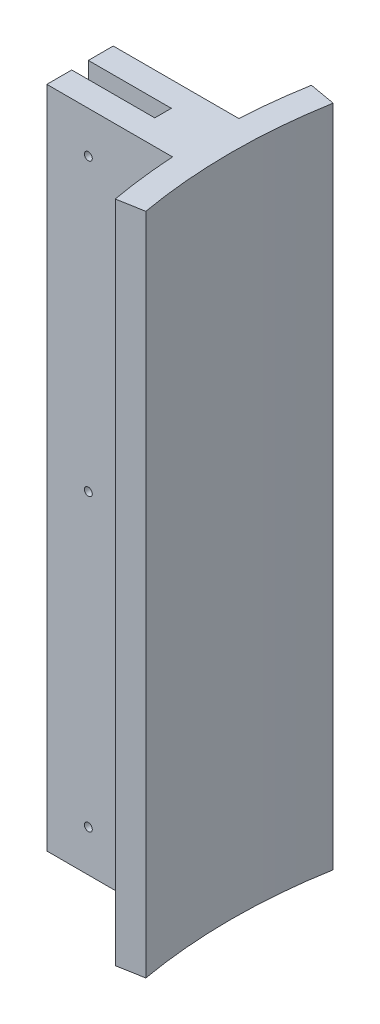
ISO-10303-21;
HEADER;
FILE_DESCRIPTION(('STEP AP214'),'2;1');
FILE_NAME('part.step','',(''),(''),'','','');
FILE_SCHEMA(('AUTOMOTIVE_DESIGN { 1 0 10303 214 1 1 1 1 }'));
ENDSEC;
DATA;
#1=APPLICATION_CONTEXT('core data for automotive mechanical design processes');
#2=APPLICATION_PROTOCOL_DEFINITION('international standard','automotive_design',2000,#1);
#3=PRODUCT_CONTEXT('',#1,'mechanical');
#4=PRODUCT('Part','Part','',(#3));
#5=PRODUCT_RELATED_PRODUCT_CATEGORY('part','',(#4));
#6=PRODUCT_DEFINITION_FORMATION('','',#4);
#7=PRODUCT_DEFINITION_CONTEXT('part definition',#1,'design');
#8=PRODUCT_DEFINITION('design','',#6,#7);
#9=PRODUCT_DEFINITION_SHAPE('','',#8);
#10=(LENGTH_UNIT() NAMED_UNIT(*) SI_UNIT(.MILLI.,.METRE.));
#11=(NAMED_UNIT(*) PLANE_ANGLE_UNIT() SI_UNIT($,.RADIAN.));
#12=(NAMED_UNIT(*) SI_UNIT($,.STERADIAN.) SOLID_ANGLE_UNIT());
#13=UNCERTAINTY_MEASURE_WITH_UNIT(LENGTH_MEASURE(1.E-05),#10,'distance_accuracy_value','');
#14=(GEOMETRIC_REPRESENTATION_CONTEXT(3) GLOBAL_UNCERTAINTY_ASSIGNED_CONTEXT((#13)) GLOBAL_UNIT_ASSIGNED_CONTEXT((#10,
#11,#12)) REPRESENTATION_CONTEXT('',''));
#15=CARTESIAN_POINT('',(0.,0.,0.));
#16=DIRECTION('',(0.,0.,1.));
#17=DIRECTION('',(1.,0.,0.));
#18=AXIS2_PLACEMENT_3D('',#15,#16,#17);
#19=CARTESIAN_POINT('',(0.,80.,0.));
#20=DIRECTION('',(0.,-1.,0.));
#21=DIRECTION('',(0.,0.,-1.));
#22=AXIS2_PLACEMENT_3D('',#19,#20,#21);
#23=CYLINDRICAL_SURFACE('',#22,65.);
#24=CARTESIAN_POINT('',(0.,0.,0.));
#25=DIRECTION('',(0.,-1.,0.));
#26=DIRECTION('',(0.,0.,-1.));
#27=AXIS2_PLACEMENT_3D('',#24,#25,#26);
#28=CIRCLE('',#27,65.);
#29=CARTESIAN_POINT('',(-64.0125039457936,0.,11.2871315483504));
#30=VERTEX_POINT('',#29);
#31=CARTESIAN_POINT('',(-64.0125039457936,0.,-11.2871315483505));
#32=VERTEX_POINT('',#31);
#33=EDGE_CURVE('E167',#30,#32,#28,.T.);
#34=ORIENTED_EDGE('',*,*,#33,.T.);
#35=DIRECTION('',(0.,-1.,0.));
#36=VECTOR('',#35,1.);
#37=CARTESIAN_POINT('',(-64.0125039457936,80.,-11.2871315483505));
#38=LINE('',#37,#36);
#39=CARTESIAN_POINT('',(-64.0125039457936,80.,-11.2871315483505));
#40=VERTEX_POINT('',#39);
#41=EDGE_CURVE('E11',#40,#32,#38,.T.);
#42=ORIENTED_EDGE('',*,*,#41,.F.);
#43=CARTESIAN_POINT('',(0.,80.,0.));
#44=DIRECTION('',(0.,-1.,0.));
#45=DIRECTION('',(0.,0.,-1.));
#46=AXIS2_PLACEMENT_3D('',#43,#44,#45);
#47=CIRCLE('',#46,65.);
#48=CARTESIAN_POINT('',(-64.0125039457936,80.,11.2871315483504));
#49=VERTEX_POINT('',#48);
#50=EDGE_CURVE('E204',#49,#40,#47,.T.);
#51=ORIENTED_EDGE('',*,*,#50,.F.);
#52=DIRECTION('',(0.,-1.,0.));
#53=VECTOR('',#52,1.);
#54=CARTESIAN_POINT('',(-64.0125039457936,80.,11.2871315483504));
#55=LINE('',#54,#53);
#56=EDGE_CURVE('E163',#49,#30,#55,.T.);
#57=ORIENTED_EDGE('',*,*,#56,.T.);
#58=EDGE_LOOP('',(#34,#42,#51,#57));
#59=FACE_BOUND('',#58,.T.);
#60=ADVANCED_FACE('F43',(#59),#23,.F.);
#61=CARTESIAN_POINT('',(-64.0125039457936,80.,-11.2871315483505));
#62=DIRECTION('',(-0.173648177666932,0.,0.984807753012208));
#63=DIRECTION('',(0.984807753012208,0.,0.173648177666932));
#64=AXIS2_PLACEMENT_3D('',#61,#62,#63);
#65=PLANE('',#64);
#66=DIRECTION('',(-0.984807753012208,0.,-0.173648177666932));
#67=VECTOR('',#66,1.);
#68=CARTESIAN_POINT('',(-64.0125039457936,0.,-11.2871315483505));
#69=LINE('',#68,#67);
#70=CARTESIAN_POINT('',(-67.1877704342609,0.,-11.8470167012067));
#71=VERTEX_POINT('',#70);
#72=EDGE_CURVE('E171',#32,#71,#69,.T.);
#73=ORIENTED_EDGE('',*,*,#72,.T.);
#74=DIRECTION('',(0.,-1.,0.));
#75=VECTOR('',#74,1.);
#76=CARTESIAN_POINT('',(-67.1877704342609,80.,-11.8470167012067));
#77=LINE('',#76,#75);
#78=CARTESIAN_POINT('',(-67.1877704342609,80.,-11.8470167012067));
#79=VERTEX_POINT('',#78);
#80=EDGE_CURVE('E52',#79,#71,#77,.T.);
#81=ORIENTED_EDGE('',*,*,#80,.F.);
#82=DIRECTION('',(-0.984807753012208,0.,-0.173648177666932));
#83=VECTOR('',#82,1.);
#84=CARTESIAN_POINT('',(-64.0125039457936,80.,-11.2871315483505));
#85=LINE('',#84,#83);
#86=EDGE_CURVE('E115',#40,#79,#85,.T.);
#87=ORIENTED_EDGE('',*,*,#86,.F.);
#88=ORIENTED_EDGE('',*,*,#41,.T.);
#89=EDGE_LOOP('',(#73,#81,#87,#88));
#90=FACE_BOUND('',#89,.T.);
#91=ADVANCED_FACE('F298',(#90),#65,.F.);
#92=CARTESIAN_POINT('',(-0.203476318140439,80.,-0.137860379546595));
#93=DIRECTION('',(0.,-1.,0.));
#94=DIRECTION('',(0.,0.,-1.));
#95=AXIS2_PLACEMENT_3D('',#92,#93,#94);
#96=CYLINDRICAL_SURFACE('',#95,68.);
#97=CARTESIAN_POINT('',(-0.203476318140439,0.,-0.137860379546595));
#98=DIRECTION('',(0.,1.,0.));
#99=DIRECTION('',(0.,0.,-1.));
#100=AXIS2_PLACEMENT_3D('',#97,#98,#99);
#101=CIRCLE('',#100,68.);
#102=CARTESIAN_POINT('',(-68.0937103547979,0.,-3.99999999999999));
#103=VERTEX_POINT('',#102);
#104=EDGE_CURVE('E175',#71,#103,#101,.T.);
#105=ORIENTED_EDGE('',*,*,#104,.T.);
#106=DIRECTION('',(0.,-1.,0.));
#107=VECTOR('',#106,1.);
#108=CARTESIAN_POINT('',(-68.0937103547979,80.,-3.99999999999999));
#109=LINE('',#108,#107);
#110=CARTESIAN_POINT('',(-68.0937103547979,80.,-3.99999999999999));
#111=VERTEX_POINT('',#110);
#112=EDGE_CURVE('E231',#111,#103,#109,.T.);
#113=ORIENTED_EDGE('',*,*,#112,.F.);
#114=CARTESIAN_POINT('',(-0.203476318140439,80.,-0.137860379546595));
#115=DIRECTION('',(0.,1.,0.));
#116=DIRECTION('',(0.,0.,-1.));
#117=AXIS2_PLACEMENT_3D('',#114,#115,#116);
#118=CIRCLE('',#117,68.);
#119=EDGE_CURVE('E241',#79,#111,#118,.T.);
#120=ORIENTED_EDGE('',*,*,#119,.F.);
#121=ORIENTED_EDGE('',*,*,#80,.T.);
#122=EDGE_LOOP('',(#105,#113,#120,#121));
#123=FACE_BOUND('',#122,.T.);
#124=ADVANCED_FACE('F239',(#123),#96,.T.);
#125=CARTESIAN_POINT('',(-68.2227730134308,80.,-3.99999999999999));
#126=DIRECTION('',(0.,0.,1.));
#127=DIRECTION('',(1.,0.,0.));
#128=AXIS2_PLACEMENT_3D('',#125,#126,#127);
#129=PLANE('',#128);
#130=CARTESIAN_POINT('',(-78.2227730134308,75.,-3.99999999999999));
#131=DIRECTION('',(0.,0.,1.));
#132=DIRECTION('',(1.,0.,0.));
#133=AXIS2_PLACEMENT_3D('',#130,#131,#132);
#134=CIRCLE('',#133,0.474999999999989);
#135=CARTESIAN_POINT('',(-77.7477730134308,75.,-3.99999999999999));
#136=VERTEX_POINT('',#135);
#137=EDGE_CURVE('E546',#136,#136,#134,.T.);
#138=ORIENTED_EDGE('',*,*,#137,.T.);
#139=EDGE_LOOP('',(#138));
#140=FACE_BOUND('',#139,.T.);
#141=CARTESIAN_POINT('',(-78.2227730134308,40.,-3.99999999999999));
#142=DIRECTION('',(0.,0.,1.));
#143=DIRECTION('',(1.,0.,0.));
#144=AXIS2_PLACEMENT_3D('',#141,#142,#143);
#145=CIRCLE('',#144,0.474999999999989);
#146=CARTESIAN_POINT('',(-77.7477730134308,40.,-3.99999999999999));
#147=VERTEX_POINT('',#146);
#148=EDGE_CURVE('E343',#147,#147,#145,.T.);
#149=ORIENTED_EDGE('',*,*,#148,.T.);
#150=EDGE_LOOP('',(#149));
#151=FACE_BOUND('',#150,.T.);
#152=CARTESIAN_POINT('',(-78.2227730134308,5.,-3.99999999999999));
#153=DIRECTION('',(0.,0.,1.));
#154=DIRECTION('',(1.,0.,0.));
#155=AXIS2_PLACEMENT_3D('',#152,#153,#154);
#156=CIRCLE('',#155,0.474999999999989);
#157=CARTESIAN_POINT('',(-77.7477730134308,5.,-3.99999999999999));
#158=VERTEX_POINT('',#157);
#159=EDGE_CURVE('E172',#158,#158,#156,.T.);
#160=ORIENTED_EDGE('',*,*,#159,.T.);
#161=EDGE_LOOP('',(#160));
#162=FACE_BOUND('',#161,.T.);
#163=DIRECTION('',(-1.,0.,0.));
#164=VECTOR('',#163,1.);
#165=CARTESIAN_POINT('',(-68.2227730134308,0.,-3.99999999999999));
#166=LINE('',#165,#164);
#167=CARTESIAN_POINT('',(-83.2227730134308,0.,-3.99999999999999));
#168=VERTEX_POINT('',#167);
#169=EDGE_CURVE('E179',#103,#168,#166,.T.);
#170=ORIENTED_EDGE('',*,*,#169,.T.);
#171=DIRECTION('',(0.,-1.,0.));
#172=VECTOR('',#171,1.);
#173=CARTESIAN_POINT('',(-83.2227730134308,80.,-3.99999999999999));
#174=LINE('',#173,#172);
#175=CARTESIAN_POINT('',(-83.2227730134308,80.,-3.99999999999999));
#176=VERTEX_POINT('',#175);
#177=EDGE_CURVE('E227',#176,#168,#174,.T.);
#178=ORIENTED_EDGE('',*,*,#177,.F.);
#179=DIRECTION('',(-1.,0.,0.));
#180=VECTOR('',#179,1.);
#181=CARTESIAN_POINT('',(-68.2227730134308,80.,-3.99999999999999));
#182=LINE('',#181,#180);
#183=EDGE_CURVE('E259',#111,#176,#182,.T.);
#184=ORIENTED_EDGE('',*,*,#183,.F.);
#185=ORIENTED_EDGE('',*,*,#112,.T.);
#186=EDGE_LOOP('',(#170,#178,#184,#185));
#187=FACE_BOUND('',#186,.T.);
#188=ADVANCED_FACE('F249',(#140,#151,#162,#187),#129,.F.);
#189=CARTESIAN_POINT('',(-83.2227730134308,80.,-3.99999999999999));
#190=DIRECTION('',(1.,0.,0.));
#191=DIRECTION('',(0.,0.,-1.));
#192=AXIS2_PLACEMENT_3D('',#189,#190,#191);
#193=PLANE('',#192);
#194=DIRECTION('',(0.,0.,1.));
#195=VECTOR('',#194,1.);
#196=CARTESIAN_POINT('',(-83.2227730134308,0.,-3.99999999999999));
#197=LINE('',#196,#195);
#198=CARTESIAN_POINT('',(-83.2227730134308,0.,-1.00000000000002));
#199=VERTEX_POINT('',#198);
#200=EDGE_CURVE('E182',#168,#199,#197,.T.);
#201=ORIENTED_EDGE('',*,*,#200,.T.);
#202=DIRECTION('',(0.,-1.,0.));
#203=VECTOR('',#202,1.);
#204=CARTESIAN_POINT('',(-83.2227730134308,80.,-1.00000000000002));
#205=LINE('',#204,#203);
#206=CARTESIAN_POINT('',(-83.2227730134308,80.,-1.00000000000002));
#207=VERTEX_POINT('',#206);
#208=EDGE_CURVE('E223',#207,#199,#205,.T.);
#209=ORIENTED_EDGE('',*,*,#208,.F.);
#210=DIRECTION('',(0.,0.,1.));
#211=VECTOR('',#210,1.);
#212=CARTESIAN_POINT('',(-83.2227730134308,80.,-3.99999999999999));
#213=LINE('',#212,#211);
#214=EDGE_CURVE('E255',#176,#207,#213,.T.);
#215=ORIENTED_EDGE('',*,*,#214,.F.);
#216=ORIENTED_EDGE('',*,*,#177,.T.);
#217=EDGE_LOOP('',(#201,#209,#215,#216));
#218=FACE_BOUND('',#217,.T.);
#219=ADVANCED_FACE('F253',(#218),#193,.F.);
#220=CARTESIAN_POINT('',(-83.2227730134308,80.,-1.00000000000002));
#221=DIRECTION('',(0.,0.,-1.));
#222=DIRECTION('',(-1.,0.,0.));
#223=AXIS2_PLACEMENT_3D('',#220,#221,#222);
#224=PLANE('',#223);
#225=CARTESIAN_POINT('',(-78.2227730134308,75.,-1.00000000000002));
#226=DIRECTION('',(0.,0.,-1.));
#227=DIRECTION('',(-1.,0.,0.));
#228=AXIS2_PLACEMENT_3D('',#225,#226,#227);
#229=CIRCLE('',#228,0.474999999999989);
#230=CARTESIAN_POINT('',(-78.6977730134308,75.,-1.00000000000002));
#231=VERTEX_POINT('',#230);
#232=EDGE_CURVE('E550',#231,#231,#229,.T.);
#233=ORIENTED_EDGE('',*,*,#232,.T.);
#234=EDGE_LOOP('',(#233));
#235=FACE_BOUND('',#234,.T.);
#236=CARTESIAN_POINT('',(-78.2227730134308,40.,-1.00000000000002));
#237=DIRECTION('',(0.,0.,-1.));
#238=DIRECTION('',(-1.,0.,0.));
#239=AXIS2_PLACEMENT_3D('',#236,#237,#238);
#240=CIRCLE('',#239,0.474999999999989);
#241=CARTESIAN_POINT('',(-78.6977730134308,40.,-1.00000000000002));
#242=VERTEX_POINT('',#241);
#243=EDGE_CURVE('E351',#242,#242,#240,.T.);
#244=ORIENTED_EDGE('',*,*,#243,.T.);
#245=EDGE_LOOP('',(#244));
#246=FACE_BOUND('',#245,.T.);
#247=CARTESIAN_POINT('',(-78.2227730134308,5.,-1.00000000000002));
#248=DIRECTION('',(0.,0.,-1.));
#249=DIRECTION('',(-1.,0.,0.));
#250=AXIS2_PLACEMENT_3D('',#247,#248,#249);
#251=CIRCLE('',#250,0.474999999999989);
#252=CARTESIAN_POINT('',(-78.6977730134308,5.,-1.00000000000002));
#253=VERTEX_POINT('',#252);
#254=EDGE_CURVE('E342',#253,#253,#251,.T.);
#255=ORIENTED_EDGE('',*,*,#254,.T.);
#256=EDGE_LOOP('',(#255));
#257=FACE_BOUND('',#256,.T.);
#258=DIRECTION('',(1.,0.,0.));
#259=VECTOR('',#258,1.);
#260=CARTESIAN_POINT('',(-83.2227730134308,0.,-1.00000000000002));
#261=LINE('',#260,#259);
#262=CARTESIAN_POINT('',(-73.2227730134308,0.,-1.00000000000002));
#263=VERTEX_POINT('',#262);
#264=EDGE_CURVE('E185',#199,#263,#261,.T.);
#265=ORIENTED_EDGE('',*,*,#264,.T.);
#266=DIRECTION('',(0.,-1.,0.));
#267=VECTOR('',#266,1.);
#268=CARTESIAN_POINT('',(-73.2227730134308,80.,-1.00000000000002));
#269=LINE('',#268,#267);
#270=CARTESIAN_POINT('',(-73.2227730134308,80.,-1.00000000000002));
#271=VERTEX_POINT('',#270);
#272=EDGE_CURVE('E219',#271,#263,#269,.T.);
#273=ORIENTED_EDGE('',*,*,#272,.F.);
#274=DIRECTION('',(1.,0.,0.));
#275=VECTOR('',#274,1.);
#276=CARTESIAN_POINT('',(-83.2227730134308,80.,-1.00000000000002));
#277=LINE('',#276,#275);
#278=EDGE_CURVE('E258',#207,#271,#277,.T.);
#279=ORIENTED_EDGE('',*,*,#278,.F.);
#280=ORIENTED_EDGE('',*,*,#208,.T.);
#281=EDGE_LOOP('',(#265,#273,#279,#280));
#282=FACE_BOUND('',#281,.T.);
#283=ADVANCED_FACE('F312',(#235,#246,#257,#282),#224,.F.);
#284=CARTESIAN_POINT('',(-73.2227730134308,80.,1.00000000000001));
#285=DIRECTION('',(1.,0.,0.));
#286=DIRECTION('',(0.,0.,-1.));
#287=AXIS2_PLACEMENT_3D('',#284,#285,#286);
#288=PLANE('',#287);
#289=DIRECTION('',(0.,0.,1.));
#290=VECTOR('',#289,1.);
#291=CARTESIAN_POINT('',(-73.2227730134308,0.,1.00000000000001));
#292=LINE('',#291,#290);
#293=CARTESIAN_POINT('',(-73.2227730134308,0.,1.00000000000001));
#294=VERTEX_POINT('',#293);
#295=EDGE_CURVE('E188',#263,#294,#292,.T.);
#296=ORIENTED_EDGE('',*,*,#295,.T.);
#297=DIRECTION('',(0.,-1.,0.));
#298=VECTOR('',#297,1.);
#299=CARTESIAN_POINT('',(-73.2227730134308,80.,1.00000000000001));
#300=LINE('',#299,#298);
#301=CARTESIAN_POINT('',(-73.2227730134308,80.,1.00000000000001));
#302=VERTEX_POINT('',#301);
#303=EDGE_CURVE('E215',#302,#294,#300,.T.);
#304=ORIENTED_EDGE('',*,*,#303,.F.);
#305=DIRECTION('',(0.,0.,1.));
#306=VECTOR('',#305,1.);
#307=CARTESIAN_POINT('',(-73.2227730134308,80.,1.00000000000001));
#308=LINE('',#307,#306);
#309=EDGE_CURVE('E263',#271,#302,#308,.T.);
#310=ORIENTED_EDGE('',*,*,#309,.F.);
#311=ORIENTED_EDGE('',*,*,#272,.T.);
#312=EDGE_LOOP('',(#296,#304,#310,#311));
#313=FACE_BOUND('',#312,.T.);
#314=ADVANCED_FACE('F315',(#313),#288,.F.);
#315=CARTESIAN_POINT('',(-83.2227730134308,80.,1.00000000000001));
#316=DIRECTION('',(0.,0.,1.));
#317=DIRECTION('',(1.,0.,0.));
#318=AXIS2_PLACEMENT_3D('',#315,#316,#317);
#319=PLANE('',#318);
#320=CARTESIAN_POINT('',(-78.2227730134308,75.,1.00000000000001));
#321=DIRECTION('',(0.,0.,1.));
#322=DIRECTION('',(1.,0.,0.));
#323=AXIS2_PLACEMENT_3D('',#320,#321,#322);
#324=CIRCLE('',#323,0.474999999999989);
#325=CARTESIAN_POINT('',(-77.7477730134308,75.,1.00000000000001));
#326=VERTEX_POINT('',#325);
#327=EDGE_CURVE('E554',#326,#326,#324,.T.);
#328=ORIENTED_EDGE('',*,*,#327,.T.);
#329=EDGE_LOOP('',(#328));
#330=FACE_BOUND('',#329,.T.);
#331=CARTESIAN_POINT('',(-78.2227730134308,40.,1.00000000000001));
#332=DIRECTION('',(0.,0.,1.));
#333=DIRECTION('',(1.,0.,0.));
#334=AXIS2_PLACEMENT_3D('',#331,#332,#333);
#335=CIRCLE('',#334,0.474999999999989);
#336=CARTESIAN_POINT('',(-77.7477730134308,40.,1.00000000000001));
#337=VERTEX_POINT('',#336);
#338=EDGE_CURVE('E539',#337,#337,#335,.T.);
#339=ORIENTED_EDGE('',*,*,#338,.T.);
#340=EDGE_LOOP('',(#339));
#341=FACE_BOUND('',#340,.T.);
#342=CARTESIAN_POINT('',(-78.2227730134308,5.,1.00000000000001));
#343=DIRECTION('',(0.,0.,1.));
#344=DIRECTION('',(1.,0.,0.));
#345=AXIS2_PLACEMENT_3D('',#342,#343,#344);
#346=CIRCLE('',#345,0.474999999999989);
#347=CARTESIAN_POINT('',(-77.7477730134308,5.,1.00000000000001));
#348=VERTEX_POINT('',#347);
#349=EDGE_CURVE('E348',#348,#348,#346,.T.);
#350=ORIENTED_EDGE('',*,*,#349,.T.);
#351=EDGE_LOOP('',(#350));
#352=FACE_BOUND('',#351,.T.);
#353=DIRECTION('',(-1.,0.,0.));
#354=VECTOR('',#353,1.);
#355=CARTESIAN_POINT('',(-83.2227730134308,0.,1.00000000000001));
#356=LINE('',#355,#354);
#357=CARTESIAN_POINT('',(-83.2227730134308,0.,1.00000000000001));
#358=VERTEX_POINT('',#357);
#359=EDGE_CURVE('E191',#294,#358,#356,.T.);
#360=ORIENTED_EDGE('',*,*,#359,.T.);
#361=DIRECTION('',(0.,-1.,0.));
#362=VECTOR('',#361,1.);
#363=CARTESIAN_POINT('',(-83.2227730134308,80.,1.00000000000001));
#364=LINE('',#363,#362);
#365=CARTESIAN_POINT('',(-83.2227730134308,80.,1.00000000000001));
#366=VERTEX_POINT('',#365);
#367=EDGE_CURVE('E211',#366,#358,#364,.T.);
#368=ORIENTED_EDGE('',*,*,#367,.F.);
#369=DIRECTION('',(-1.,0.,0.));
#370=VECTOR('',#369,1.);
#371=CARTESIAN_POINT('',(-83.2227730134308,80.,1.00000000000001));
#372=LINE('',#371,#370);
#373=EDGE_CURVE('E270',#302,#366,#372,.T.);
#374=ORIENTED_EDGE('',*,*,#373,.F.);
#375=ORIENTED_EDGE('',*,*,#303,.T.);
#376=EDGE_LOOP('',(#360,#368,#374,#375));
#377=FACE_BOUND('',#376,.T.);
#378=ADVANCED_FACE('F278',(#330,#341,#352,#377),#319,.F.);
#379=CARTESIAN_POINT('',(-83.2227730134308,80.,1.00000000000001));
#380=DIRECTION('',(1.,0.,0.));
#381=DIRECTION('',(0.,0.,-1.));
#382=AXIS2_PLACEMENT_3D('',#379,#380,#381);
#383=PLANE('',#382);
#384=DIRECTION('',(0.,0.,1.));
#385=VECTOR('',#384,1.);
#386=CARTESIAN_POINT('',(-83.2227730134308,0.,1.00000000000001));
#387=LINE('',#386,#385);
#388=CARTESIAN_POINT('',(-83.2227730134308,0.,4.00000000000001));
#389=VERTEX_POINT('',#388);
#390=EDGE_CURVE('E194',#358,#389,#387,.T.);
#391=ORIENTED_EDGE('',*,*,#390,.T.);
#392=DIRECTION('',(0.,-1.,0.));
#393=VECTOR('',#392,1.);
#394=CARTESIAN_POINT('',(-83.2227730134308,80.,4.00000000000001));
#395=LINE('',#394,#393);
#396=CARTESIAN_POINT('',(-83.2227730134308,80.,4.00000000000001));
#397=VERTEX_POINT('',#396);
#398=EDGE_CURVE('E156',#397,#389,#395,.T.);
#399=ORIENTED_EDGE('',*,*,#398,.F.);
#400=DIRECTION('',(0.,0.,1.));
#401=VECTOR('',#400,1.);
#402=CARTESIAN_POINT('',(-83.2227730134308,80.,1.00000000000001));
#403=LINE('',#402,#401);
#404=EDGE_CURVE('E146',#366,#397,#403,.T.);
#405=ORIENTED_EDGE('',*,*,#404,.F.);
#406=ORIENTED_EDGE('',*,*,#367,.T.);
#407=EDGE_LOOP('',(#391,#399,#405,#406));
#408=FACE_BOUND('',#407,.T.);
#409=ADVANCED_FACE('F282',(#408),#383,.F.);
#410=CARTESIAN_POINT('',(-68.2227730134308,80.,4.00000000000001));
#411=DIRECTION('',(0.,0.,-1.));
#412=DIRECTION('',(-1.,0.,0.));
#413=AXIS2_PLACEMENT_3D('',#410,#411,#412);
#414=PLANE('',#413);
#415=CARTESIAN_POINT('',(-78.2227730134308,75.,4.00000000000001));
#416=DIRECTION('',(0.,0.,1.));
#417=DIRECTION('',(1.,0.,0.));
#418=AXIS2_PLACEMENT_3D('',#415,#416,#417);
#419=CIRCLE('',#418,0.474999999999989);
#420=CARTESIAN_POINT('',(-77.7477730134308,75.,4.00000000000001));
#421=VERTEX_POINT('',#420);
#422=EDGE_CURVE('E332',#421,#421,#419,.T.);
#423=ORIENTED_EDGE('',*,*,#422,.F.);
#424=EDGE_LOOP('',(#423));
#425=FACE_BOUND('',#424,.T.);
#426=CARTESIAN_POINT('',(-78.2227730134308,40.,4.00000000000001));
#427=DIRECTION('',(0.,0.,1.));
#428=DIRECTION('',(1.,0.,0.));
#429=AXIS2_PLACEMENT_3D('',#426,#427,#428);
#430=CIRCLE('',#429,0.474999999999989);
#431=CARTESIAN_POINT('',(-77.7477730134308,40.,4.00000000000001));
#432=VERTEX_POINT('',#431);
#433=EDGE_CURVE('E336',#432,#432,#430,.T.);
#434=ORIENTED_EDGE('',*,*,#433,.F.);
#435=EDGE_LOOP('',(#434));
#436=FACE_BOUND('',#435,.T.);
#437=CARTESIAN_POINT('',(-78.2227730134308,5.,4.00000000000001));
#438=DIRECTION('',(0.,0.,1.));
#439=DIRECTION('',(1.,0.,0.));
#440=AXIS2_PLACEMENT_3D('',#437,#438,#439);
#441=CIRCLE('',#440,0.474999999999989);
#442=CARTESIAN_POINT('',(-77.7477730134308,5.,4.00000000000001));
#443=VERTEX_POINT('',#442);
#444=EDGE_CURVE('E339',#443,#443,#441,.T.);
#445=ORIENTED_EDGE('',*,*,#444,.F.);
#446=EDGE_LOOP('',(#445));
#447=FACE_BOUND('',#446,.T.);
#448=DIRECTION('',(1.,0.,0.));
#449=VECTOR('',#448,1.);
#450=CARTESIAN_POINT('',(-68.2227730134308,0.,4.00000000000001));
#451=LINE('',#450,#449);
#452=CARTESIAN_POINT('',(-68.0774633196374,0.,4.00000000000005));
#453=VERTEX_POINT('',#452);
#454=EDGE_CURVE('E154',#389,#453,#451,.T.);
#455=ORIENTED_EDGE('',*,*,#454,.T.);
#456=DIRECTION('',(0.,-1.,0.));
#457=VECTOR('',#456,1.);
#458=CARTESIAN_POINT('',(-68.0774633196374,80.,4.00000000000005));
#459=LINE('',#458,#457);
#460=CARTESIAN_POINT('',(-68.0774633196374,80.,4.00000000000005));
#461=VERTEX_POINT('',#460);
#462=EDGE_CURVE('E152',#461,#453,#459,.T.);
#463=ORIENTED_EDGE('',*,*,#462,.F.);
#464=DIRECTION('',(1.,0.,0.));
#465=VECTOR('',#464,1.);
#466=CARTESIAN_POINT('',(-68.2227730134308,80.,4.00000000000001));
#467=LINE('',#466,#465);
#468=EDGE_CURVE('E140',#397,#461,#467,.T.);
#469=ORIENTED_EDGE('',*,*,#468,.F.);
#470=ORIENTED_EDGE('',*,*,#398,.T.);
#471=EDGE_LOOP('',(#455,#463,#469,#470));
#472=FACE_BOUND('',#471,.T.);
#473=ADVANCED_FACE('F153',(#425,#436,#447,#472),#414,.F.);
#474=CARTESIAN_POINT('',(-0.203476318140439,80.,-0.137860379546595));
#475=DIRECTION('',(0.,-1.,0.));
#476=DIRECTION('',(0.,0.,-1.));
#477=AXIS2_PLACEMENT_3D('',#474,#475,#476);
#478=CYLINDRICAL_SURFACE('',#477,68.);
#479=CARTESIAN_POINT('',(-0.203476318140439,0.,-0.137860379546595));
#480=DIRECTION('',(0.,1.,0.));
#481=DIRECTION('',(0.,0.,-1.));
#482=AXIS2_PLACEMENT_3D('',#479,#480,#481);
#483=CIRCLE('',#482,68.);
#484=CARTESIAN_POINT('',(-67.1404804607066,0.,11.838678202952));
#485=VERTEX_POINT('',#484);
#486=EDGE_CURVE('E101',#453,#485,#483,.T.);
#487=ORIENTED_EDGE('',*,*,#486,.T.);
#488=DIRECTION('',(0.,-1.,0.));
#489=VECTOR('',#488,1.);
#490=CARTESIAN_POINT('',(-67.1404804607066,80.,11.838678202952));
#491=LINE('',#490,#489);
#492=CARTESIAN_POINT('',(-67.1404804607066,80.,11.838678202952));
#493=VERTEX_POINT('',#492);
#494=EDGE_CURVE('E157',#493,#485,#491,.T.);
#495=ORIENTED_EDGE('',*,*,#494,.F.);
#496=CARTESIAN_POINT('',(-0.203476318140439,80.,-0.137860379546595));
#497=DIRECTION('',(0.,1.,0.));
#498=DIRECTION('',(0.,0.,-1.));
#499=AXIS2_PLACEMENT_3D('',#496,#497,#498);
#500=CIRCLE('',#499,68.);
#501=EDGE_CURVE('E144',#461,#493,#500,.T.);
#502=ORIENTED_EDGE('',*,*,#501,.F.);
#503=ORIENTED_EDGE('',*,*,#462,.T.);
#504=EDGE_LOOP('',(#487,#495,#502,#503));
#505=FACE_BOUND('',#504,.T.);
#506=ADVANCED_FACE('F159',(#505),#478,.T.);
#507=CARTESIAN_POINT('',(-64.0125039457936,80.,11.2871315483504));
#508=DIRECTION('',(-0.173648177666929,0.,-0.984807753012208));
#509=DIRECTION('',(-0.984807753012208,0.,0.173648177666929));
#510=AXIS2_PLACEMENT_3D('',#507,#508,#509);
#511=PLANE('',#510);
#512=DIRECTION('',(0.984807753012208,0.,-0.173648177666929));
#513=VECTOR('',#512,1.);
#514=CARTESIAN_POINT('',(-64.0125039457936,0.,11.2871315483504));
#515=LINE('',#514,#513);
#516=EDGE_CURVE('E107',#485,#30,#515,.T.);
#517=ORIENTED_EDGE('',*,*,#516,.T.);
#518=ORIENTED_EDGE('',*,*,#56,.F.);
#519=DIRECTION('',(0.984807753012208,0.,-0.173648177666929));
#520=VECTOR('',#519,1.);
#521=CARTESIAN_POINT('',(-64.0125039457936,80.,11.2871315483504));
#522=LINE('',#521,#520);
#523=EDGE_CURVE('E60',#493,#49,#522,.T.);
#524=ORIENTED_EDGE('',*,*,#523,.F.);
#525=ORIENTED_EDGE('',*,*,#494,.T.);
#526=EDGE_LOOP('',(#517,#518,#524,#525));
#527=FACE_BOUND('',#526,.T.);
#528=ADVANCED_FACE('F287',(#527),#511,.F.);
#529=CARTESIAN_POINT('',(0.,80.,0.));
#530=DIRECTION('',(0.,-1.,0.));
#531=DIRECTION('',(0.,0.,-1.));
#532=AXIS2_PLACEMENT_3D('',#529,#530,#531);
#533=PLANE('',#532);
#534=ORIENTED_EDGE('',*,*,#50,.T.);
#535=ORIENTED_EDGE('',*,*,#86,.T.);
#536=ORIENTED_EDGE('',*,*,#119,.T.);
#537=ORIENTED_EDGE('',*,*,#183,.T.);
#538=ORIENTED_EDGE('',*,*,#214,.T.);
#539=ORIENTED_EDGE('',*,*,#278,.T.);
#540=ORIENTED_EDGE('',*,*,#309,.T.);
#541=ORIENTED_EDGE('',*,*,#373,.T.);
#542=ORIENTED_EDGE('',*,*,#404,.T.);
#543=ORIENTED_EDGE('',*,*,#468,.T.);
#544=ORIENTED_EDGE('',*,*,#501,.T.);
#545=ORIENTED_EDGE('',*,*,#523,.T.);
#546=EDGE_LOOP('',(#534,#535,#536,#537,#538,#539,#540,#541,#542,#543,#544,#545));
#547=FACE_BOUND('',#546,.T.);
#548=ADVANCED_FACE('F142',(#547),#533,.F.);
#549=CARTESIAN_POINT('',(0.,0.,0.));
#550=DIRECTION('',(0.,-1.,0.));
#551=DIRECTION('',(0.,0.,-1.));
#552=AXIS2_PLACEMENT_3D('',#549,#550,#551);
#553=PLANE('',#552);
#554=ORIENTED_EDGE('',*,*,#33,.F.);
#555=ORIENTED_EDGE('',*,*,#516,.F.);
#556=ORIENTED_EDGE('',*,*,#486,.F.);
#557=ORIENTED_EDGE('',*,*,#454,.F.);
#558=ORIENTED_EDGE('',*,*,#390,.F.);
#559=ORIENTED_EDGE('',*,*,#359,.F.);
#560=ORIENTED_EDGE('',*,*,#295,.F.);
#561=ORIENTED_EDGE('',*,*,#264,.F.);
#562=ORIENTED_EDGE('',*,*,#200,.F.);
#563=ORIENTED_EDGE('',*,*,#169,.F.);
#564=ORIENTED_EDGE('',*,*,#104,.F.);
#565=ORIENTED_EDGE('',*,*,#72,.F.);
#566=EDGE_LOOP('',(#554,#555,#556,#557,#558,#559,#560,#561,#562,#563,#564,#565));
#567=FACE_BOUND('',#566,.T.);
#568=ADVANCED_FACE('F244',(#567),#553,.T.);
#569=CARTESIAN_POINT('',(-78.2227730134308,5.,4.00000000000001));
#570=DIRECTION('',(0.,0.,1.));
#571=DIRECTION('',(1.,0.,0.));
#572=AXIS2_PLACEMENT_3D('',#569,#570,#571);
#573=CYLINDRICAL_SURFACE('',#572,0.474999999999989);
#574=ORIENTED_EDGE('',*,*,#444,.T.);
#575=EDGE_LOOP('',(#574));
#576=FACE_BOUND('',#575,.T.);
#577=ORIENTED_EDGE('',*,*,#349,.F.);
#578=EDGE_LOOP('',(#577));
#579=FACE_BOUND('',#578,.T.);
#580=ADVANCED_FACE('F371',(#576,#579),#573,.F.);
#581=ORIENTED_EDGE('',*,*,#254,.F.);
#582=EDGE_LOOP('',(#581));
#583=FACE_BOUND('',#582,.T.);
#584=ORIENTED_EDGE('',*,*,#159,.F.);
#585=EDGE_LOOP('',(#584));
#586=FACE_BOUND('',#585,.T.);
#587=ADVANCED_FACE('F368',(#583,#586),#573,.F.);
#588=CARTESIAN_POINT('',(-78.2227730134308,40.,4.00000000000001));
#589=DIRECTION('',(0.,0.,1.));
#590=DIRECTION('',(1.,0.,0.));
#591=AXIS2_PLACEMENT_3D('',#588,#589,#590);
#592=CYLINDRICAL_SURFACE('',#591,0.474999999999989);
#593=ORIENTED_EDGE('',*,*,#433,.T.);
#594=EDGE_LOOP('',(#593));
#595=FACE_BOUND('',#594,.T.);
#596=ORIENTED_EDGE('',*,*,#338,.F.);
#597=EDGE_LOOP('',(#596));
#598=FACE_BOUND('',#597,.T.);
#599=ADVANCED_FACE('F370',(#595,#598),#592,.F.);
#600=ORIENTED_EDGE('',*,*,#243,.F.);
#601=EDGE_LOOP('',(#600));
#602=FACE_BOUND('',#601,.T.);
#603=ORIENTED_EDGE('',*,*,#148,.F.);
#604=EDGE_LOOP('',(#603));
#605=FACE_BOUND('',#604,.T.);
#606=ADVANCED_FACE('F378',(#602,#605),#592,.F.);
#607=CARTESIAN_POINT('',(-78.2227730134308,75.,4.00000000000001));
#608=DIRECTION('',(0.,0.,1.));
#609=DIRECTION('',(1.,0.,0.));
#610=AXIS2_PLACEMENT_3D('',#607,#608,#609);
#611=CYLINDRICAL_SURFACE('',#610,0.474999999999989);
#612=ORIENTED_EDGE('',*,*,#422,.T.);
#613=EDGE_LOOP('',(#612));
#614=FACE_BOUND('',#613,.T.);
#615=ORIENTED_EDGE('',*,*,#327,.F.);
#616=EDGE_LOOP('',(#615));
#617=FACE_BOUND('',#616,.T.);
#618=ADVANCED_FACE('F405',(#614,#617),#611,.F.);
#619=ORIENTED_EDGE('',*,*,#232,.F.);
#620=EDGE_LOOP('',(#619));
#621=FACE_BOUND('',#620,.T.);
#622=ORIENTED_EDGE('',*,*,#137,.F.);
#623=EDGE_LOOP('',(#622));
#624=FACE_BOUND('',#623,.T.);
#625=ADVANCED_FACE('F409',(#621,#624),#611,.F.);
#626=CLOSED_SHELL('',(#60,#91,#124,#188,#219,#283,#314,#378,#409,#473,#506,#528,#548,#568,#580,
#587,#599,#606,#618,#625));
#627=MANIFOLD_SOLID_BREP('B2',#626);
#628=ADVANCED_BREP_SHAPE_REPRESENTATION('',(#18,#627),#14);
#629=SHAPE_DEFINITION_REPRESENTATION(#9,#628);
ENDSEC;
END-ISO-10303-21;
